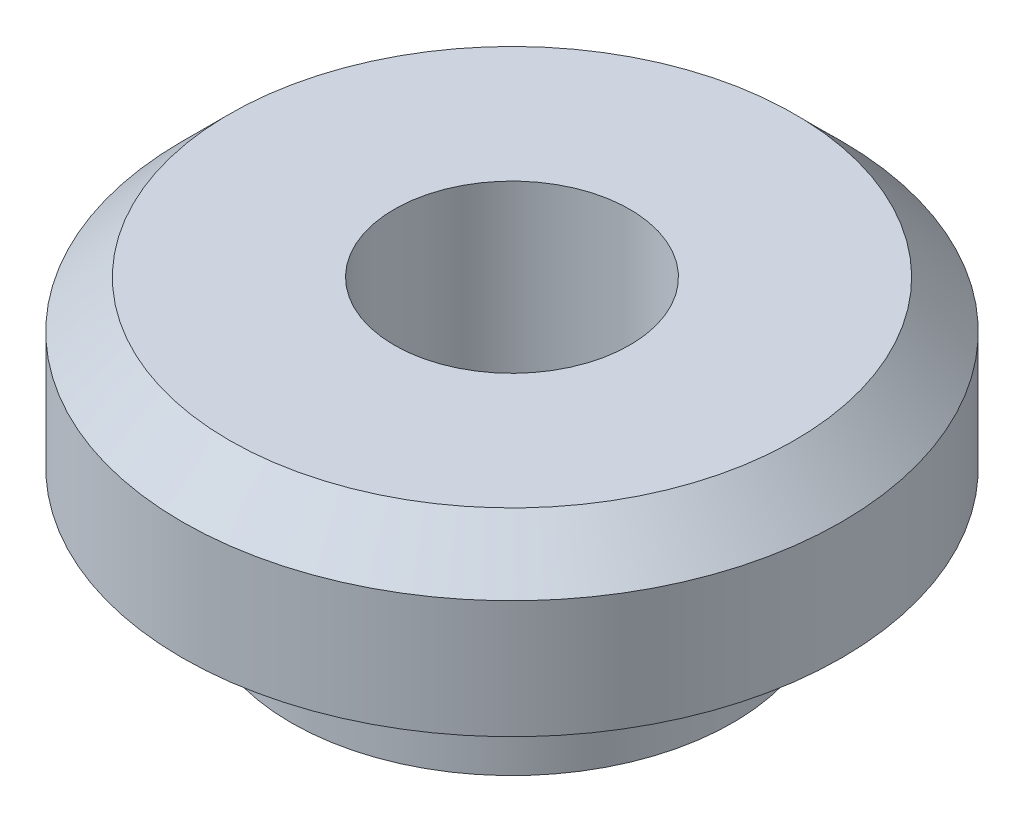
ISO-10303-21;
HEADER;
FILE_DESCRIPTION(('STEP AP214'),'2;1');
FILE_NAME('part.step','',(''),(''),'','','');
FILE_SCHEMA(('AUTOMOTIVE_DESIGN { 1 0 10303 214 1 1 1 1 }'));
ENDSEC;
DATA;
#1=APPLICATION_CONTEXT('core data for automotive mechanical design processes');
#2=APPLICATION_PROTOCOL_DEFINITION('international standard','automotive_design',2000,#1);
#3=PRODUCT_CONTEXT('',#1,'mechanical');
#4=PRODUCT('Part','Part','',(#3));
#5=PRODUCT_RELATED_PRODUCT_CATEGORY('part','',(#4));
#6=PRODUCT_DEFINITION_FORMATION('','',#4);
#7=PRODUCT_DEFINITION_CONTEXT('part definition',#1,'design');
#8=PRODUCT_DEFINITION('design','',#6,#7);
#9=PRODUCT_DEFINITION_SHAPE('','',#8);
#10=(LENGTH_UNIT() NAMED_UNIT(*) SI_UNIT(.MILLI.,.METRE.));
#11=(NAMED_UNIT(*) PLANE_ANGLE_UNIT() SI_UNIT($,.RADIAN.));
#12=(NAMED_UNIT(*) SI_UNIT($,.STERADIAN.) SOLID_ANGLE_UNIT());
#13=UNCERTAINTY_MEASURE_WITH_UNIT(LENGTH_MEASURE(1.E-05),#10,'distance_accuracy_value','');
#14=(GEOMETRIC_REPRESENTATION_CONTEXT(3) GLOBAL_UNCERTAINTY_ASSIGNED_CONTEXT((#13)) GLOBAL_UNIT_ASSIGNED_CONTEXT((#10,
#11,#12)) REPRESENTATION_CONTEXT('',''));
#15=CARTESIAN_POINT('',(0.,0.,0.));
#16=DIRECTION('',(0.,0.,1.));
#17=DIRECTION('',(1.,0.,0.));
#18=AXIS2_PLACEMENT_3D('',#15,#16,#17);
#19=CARTESIAN_POINT('',(0.,1.778,1.27));
#20=DIRECTION('',(0.,1.,0.));
#21=DIRECTION('',(0.,0.,1.));
#22=AXIS2_PLACEMENT_3D('',#19,#20,#21);
#23=PLANE('',#22);
#24=CARTESIAN_POINT('',(0.,1.778,0.));
#25=DIRECTION('',(0.,1.,0.));
#26=DIRECTION('',(0.,0.,1.));
#27=AXIS2_PLACEMENT_3D('',#24,#25,#26);
#28=CIRCLE('',#27,3.048);
#29=CARTESIAN_POINT('',(0.,1.778,3.048));
#30=VERTEX_POINT('',#29);
#31=EDGE_CURVE('E10',#30,#30,#28,.T.);
#32=ORIENTED_EDGE('',*,*,#31,.T.);
#33=EDGE_LOOP('',(#32));
#34=FACE_BOUND('',#33,.T.);
#35=CARTESIAN_POINT('',(0.,1.778,0.));
#36=DIRECTION('',(0.,1.,0.));
#37=DIRECTION('',(0.,0.,1.));
#38=AXIS2_PLACEMENT_3D('',#35,#36,#37);
#39=CIRCLE('',#38,1.27);
#40=CARTESIAN_POINT('',(0.,1.778,1.27));
#41=VERTEX_POINT('',#40);
#42=EDGE_CURVE('E75',#41,#41,#39,.T.);
#43=ORIENTED_EDGE('',*,*,#42,.F.);
#44=EDGE_LOOP('',(#43));
#45=FACE_BOUND('',#44,.T.);
#46=ADVANCED_FACE('F41',(#34,#45),#23,.T.);
#47=CARTESIAN_POINT('',(0.,1.778,0.));
#48=DIRECTION('',(0.,-1.,0.));
#49=DIRECTION('',(0.,0.,-1.));
#50=AXIS2_PLACEMENT_3D('',#47,#48,#49);
#51=CONICAL_SURFACE('',#50,3.048,0.785398163397447);
#52=CARTESIAN_POINT('',(0.,1.27,0.));
#53=DIRECTION('',(0.,1.,0.));
#54=DIRECTION('',(0.,0.,1.));
#55=AXIS2_PLACEMENT_3D('',#52,#53,#54);
#56=CIRCLE('',#55,3.556);
#57=CARTESIAN_POINT('',(0.,1.27,3.556));
#58=VERTEX_POINT('',#57);
#59=EDGE_CURVE('E48',#58,#58,#56,.T.);
#60=ORIENTED_EDGE('',*,*,#59,.T.);
#61=EDGE_LOOP('',(#60));
#62=FACE_BOUND('',#61,.T.);
#63=ORIENTED_EDGE('',*,*,#31,.F.);
#64=EDGE_LOOP('',(#63));
#65=FACE_BOUND('',#64,.T.);
#66=ADVANCED_FACE('F84',(#62,#65),#51,.T.);
#67=CARTESIAN_POINT('',(0.,40.,0.));
#68=DIRECTION('',(0.,1.,0.));
#69=DIRECTION('',(0.,0.,1.));
#70=AXIS2_PLACEMENT_3D('',#67,#68,#69);
#71=CYLINDRICAL_SURFACE('',#70,3.556);
#72=CARTESIAN_POINT('',(0.,0.,0.));
#73=DIRECTION('',(0.,1.,0.));
#74=DIRECTION('',(0.,0.,1.));
#75=AXIS2_PLACEMENT_3D('',#72,#73,#74);
#76=CIRCLE('',#75,3.556);
#77=CARTESIAN_POINT('',(0.,0.,3.556));
#78=VERTEX_POINT('',#77);
#79=EDGE_CURVE('E54',#78,#78,#76,.T.);
#80=ORIENTED_EDGE('',*,*,#79,.T.);
#81=EDGE_LOOP('',(#80));
#82=FACE_BOUND('',#81,.T.);
#83=ORIENTED_EDGE('',*,*,#59,.F.);
#84=EDGE_LOOP('',(#83));
#85=FACE_BOUND('',#84,.T.);
#86=ADVANCED_FACE('F86',(#82,#85),#71,.T.);
#87=CARTESIAN_POINT('',(0.,0.,3.556));
#88=DIRECTION('',(0.,-1.,0.));
#89=DIRECTION('',(0.,0.,-1.));
#90=AXIS2_PLACEMENT_3D('',#87,#88,#89);
#91=PLANE('',#90);
#92=CARTESIAN_POINT('',(0.,0.,0.));
#93=DIRECTION('',(0.,1.,0.));
#94=DIRECTION('',(0.,0.,1.));
#95=AXIS2_PLACEMENT_3D('',#92,#93,#94);
#96=CIRCLE('',#95,2.38125);
#97=CARTESIAN_POINT('',(0.,0.,2.38125));
#98=VERTEX_POINT('',#97);
#99=EDGE_CURVE('E62',#98,#98,#96,.T.);
#100=ORIENTED_EDGE('',*,*,#99,.T.);
#101=EDGE_LOOP('',(#100));
#102=FACE_BOUND('',#101,.T.);
#103=ORIENTED_EDGE('',*,*,#79,.F.);
#104=EDGE_LOOP('',(#103));
#105=FACE_BOUND('',#104,.T.);
#106=ADVANCED_FACE('F91',(#102,#105),#91,.T.);
#107=CARTESIAN_POINT('',(0.,40.,0.));
#108=DIRECTION('',(0.,1.,0.));
#109=DIRECTION('',(0.,0.,1.));
#110=AXIS2_PLACEMENT_3D('',#107,#108,#109);
#111=CYLINDRICAL_SURFACE('',#110,2.38125);
#112=CARTESIAN_POINT('',(0.,-1.1938,0.));
#113=DIRECTION('',(0.,1.,0.));
#114=DIRECTION('',(0.,0.,1.));
#115=AXIS2_PLACEMENT_3D('',#112,#113,#114);
#116=CIRCLE('',#115,2.38125);
#117=CARTESIAN_POINT('',(0.,-1.1938,2.38125));
#118=VERTEX_POINT('',#117);
#119=EDGE_CURVE('E66',#118,#118,#116,.T.);
#120=ORIENTED_EDGE('',*,*,#119,.T.);
#121=EDGE_LOOP('',(#120));
#122=FACE_BOUND('',#121,.T.);
#123=ORIENTED_EDGE('',*,*,#99,.F.);
#124=EDGE_LOOP('',(#123));
#125=FACE_BOUND('',#124,.T.);
#126=ADVANCED_FACE('F96',(#122,#125),#111,.T.);
#127=CARTESIAN_POINT('',(0.,-1.1938,2.38125));
#128=DIRECTION('',(0.,-1.,0.));
#129=DIRECTION('',(0.,0.,-1.));
#130=AXIS2_PLACEMENT_3D('',#127,#128,#129);
#131=PLANE('',#130);
#132=CARTESIAN_POINT('',(0.,-1.1938,0.));
#133=DIRECTION('',(0.,1.,0.));
#134=DIRECTION('',(0.,0.,1.));
#135=AXIS2_PLACEMENT_3D('',#132,#133,#134);
#136=CIRCLE('',#135,1.27);
#137=CARTESIAN_POINT('',(0.,-1.1938,1.27));
#138=VERTEX_POINT('',#137);
#139=EDGE_CURVE('E71',#138,#138,#136,.T.);
#140=ORIENTED_EDGE('',*,*,#139,.T.);
#141=EDGE_LOOP('',(#140));
#142=FACE_BOUND('',#141,.T.);
#143=ORIENTED_EDGE('',*,*,#119,.F.);
#144=EDGE_LOOP('',(#143));
#145=FACE_BOUND('',#144,.T.);
#146=ADVANCED_FACE('F105',(#142,#145),#131,.T.);
#147=CARTESIAN_POINT('',(0.,40.,0.));
#148=DIRECTION('',(0.,1.,0.));
#149=DIRECTION('',(0.,0.,1.));
#150=AXIS2_PLACEMENT_3D('',#147,#148,#149);
#151=CYLINDRICAL_SURFACE('',#150,1.27);
#152=ORIENTED_EDGE('',*,*,#139,.F.);
#153=EDGE_LOOP('',(#152));
#154=FACE_BOUND('',#153,.T.);
#155=ORIENTED_EDGE('',*,*,#42,.T.);
#156=EDGE_LOOP('',(#155));
#157=FACE_BOUND('',#156,.T.);
#158=ADVANCED_FACE('F78',(#154,#157),#151,.F.);
#159=CLOSED_SHELL('',(#46,#66,#86,#106,#126,#146,#158));
#160=MANIFOLD_SOLID_BREP('B2',#159);
#161=ADVANCED_BREP_SHAPE_REPRESENTATION('',(#18,#160),#14);
#162=SHAPE_DEFINITION_REPRESENTATION(#9,#161);
ENDSEC;
END-ISO-10303-21;
